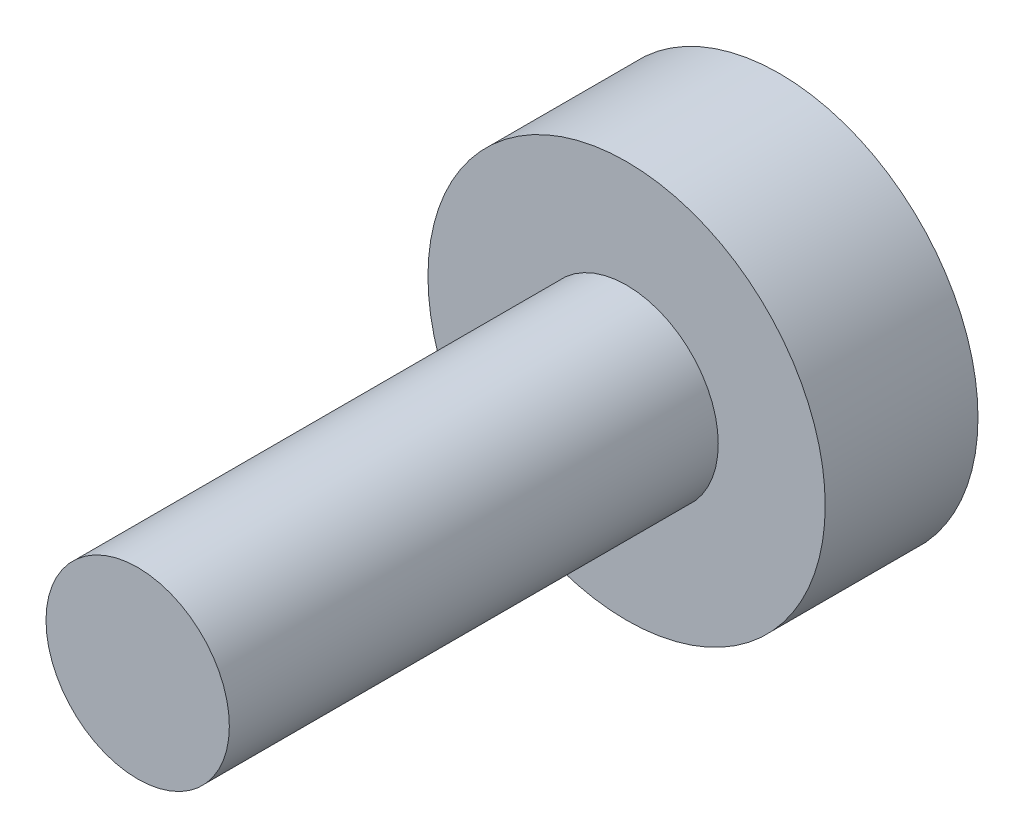
ISO-10303-21;
HEADER;
FILE_DESCRIPTION(('STEP AP214'),'2;1');
FILE_NAME('part.step','',(''),(''),'','','');
FILE_SCHEMA(('AUTOMOTIVE_DESIGN { 1 0 10303 214 1 1 1 1 }'));
ENDSEC;
DATA;
#1=APPLICATION_CONTEXT('core data for automotive mechanical design processes');
#2=APPLICATION_PROTOCOL_DEFINITION('international standard','automotive_design',2000,#1);
#3=PRODUCT_CONTEXT('',#1,'mechanical');
#4=PRODUCT('Part','Part','',(#3));
#5=PRODUCT_RELATED_PRODUCT_CATEGORY('part','',(#4));
#6=PRODUCT_DEFINITION_FORMATION('','',#4);
#7=PRODUCT_DEFINITION_CONTEXT('part definition',#1,'design');
#8=PRODUCT_DEFINITION('design','',#6,#7);
#9=PRODUCT_DEFINITION_SHAPE('','',#8);
#10=(LENGTH_UNIT() NAMED_UNIT(*) SI_UNIT(.MILLI.,.METRE.));
#11=(NAMED_UNIT(*) PLANE_ANGLE_UNIT() SI_UNIT($,.RADIAN.));
#12=(NAMED_UNIT(*) SI_UNIT($,.STERADIAN.) SOLID_ANGLE_UNIT());
#13=UNCERTAINTY_MEASURE_WITH_UNIT(LENGTH_MEASURE(1.E-05),#10,'distance_accuracy_value','');
#14=(GEOMETRIC_REPRESENTATION_CONTEXT(3) GLOBAL_UNCERTAINTY_ASSIGNED_CONTEXT((#13)) GLOBAL_UNIT_ASSIGNED_CONTEXT((#10,
#11,#12)) REPRESENTATION_CONTEXT('',''));
#15=CARTESIAN_POINT('',(0.,0.,0.));
#16=DIRECTION('',(0.,0.,1.));
#17=DIRECTION('',(1.,0.,0.));
#18=AXIS2_PLACEMENT_3D('',#15,#16,#17);
#19=CARTESIAN_POINT('',(0.,0.,5.));
#20=DIRECTION('',(0.,0.,-1.));
#21=DIRECTION('',(-1.,0.,0.));
#22=AXIS2_PLACEMENT_3D('',#19,#20,#21);
#23=CYLINDRICAL_SURFACE('',#22,6.5);
#24=CARTESIAN_POINT('',(0.,0.,5.));
#25=DIRECTION('',(0.,0.,1.));
#26=DIRECTION('',(1.,0.,0.));
#27=AXIS2_PLACEMENT_3D('',#24,#25,#26);
#28=CIRCLE('',#27,6.5);
#29=CARTESIAN_POINT('',(6.5,0.,5.));
#30=VERTEX_POINT('',#29);
#31=EDGE_CURVE('E10',#30,#30,#28,.T.);
#32=ORIENTED_EDGE('',*,*,#31,.F.);
#33=EDGE_LOOP('',(#32));
#34=FACE_BOUND('',#33,.T.);
#35=CARTESIAN_POINT('',(0.,0.,0.));
#36=DIRECTION('',(0.,0.,1.));
#37=DIRECTION('',(1.,0.,0.));
#38=AXIS2_PLACEMENT_3D('',#35,#36,#37);
#39=CIRCLE('',#38,6.5);
#40=CARTESIAN_POINT('',(6.5,0.,0.));
#41=VERTEX_POINT('',#40);
#42=EDGE_CURVE('E42',#41,#41,#39,.T.);
#43=ORIENTED_EDGE('',*,*,#42,.T.);
#44=EDGE_LOOP('',(#43));
#45=FACE_BOUND('',#44,.T.);
#46=ADVANCED_FACE('F39',(#34,#45),#23,.T.);
#47=CARTESIAN_POINT('',(0.,0.,5.));
#48=DIRECTION('',(0.,0.,1.));
#49=DIRECTION('',(1.,0.,0.));
#50=AXIS2_PLACEMENT_3D('',#47,#48,#49);
#51=PLANE('',#50);
#52=CARTESIAN_POINT('',(0.,0.,5.));
#53=DIRECTION('',(0.,0.,1.));
#54=DIRECTION('',(1.,0.,0.));
#55=AXIS2_PLACEMENT_3D('',#52,#53,#54);
#56=CIRCLE('',#55,3.);
#57=CARTESIAN_POINT('',(-3.,0.,5.));
#58=VERTEX_POINT('',#57);
#59=EDGE_CURVE('E49',#58,#58,#56,.F.);
#60=ORIENTED_EDGE('',*,*,#59,.T.);
#61=EDGE_LOOP('',(#60));
#62=FACE_BOUND('',#61,.T.);
#63=ORIENTED_EDGE('',*,*,#31,.T.);
#64=EDGE_LOOP('',(#63));
#65=FACE_BOUND('',#64,.T.);
#66=ADVANCED_FACE('F69',(#62,#65),#51,.T.);
#67=CARTESIAN_POINT('',(0.,0.,0.));
#68=DIRECTION('',(0.,0.,1.));
#69=DIRECTION('',(1.,0.,0.));
#70=AXIS2_PLACEMENT_3D('',#67,#68,#69);
#71=PLANE('',#70);
#72=ORIENTED_EDGE('',*,*,#42,.F.);
#73=EDGE_LOOP('',(#72));
#74=FACE_BOUND('',#73,.T.);
#75=ADVANCED_FACE('F61',(#74),#71,.F.);
#76=CARTESIAN_POINT('',(0.,0.,21.));
#77=DIRECTION('',(0.,0.,-1.));
#78=DIRECTION('',(-1.,0.,0.));
#79=AXIS2_PLACEMENT_3D('',#76,#77,#78);
#80=CYLINDRICAL_SURFACE('',#79,3.);
#81=CARTESIAN_POINT('',(0.,0.,21.));
#82=DIRECTION('',(0.,0.,1.));
#83=DIRECTION('',(1.,0.,0.));
#84=AXIS2_PLACEMENT_3D('',#81,#82,#83);
#85=CIRCLE('',#84,3.);
#86=CARTESIAN_POINT('',(-3.,0.,21.));
#87=VERTEX_POINT('',#86);
#88=EDGE_CURVE('E53',#87,#87,#85,.T.);
#89=CARTESIAN_POINT('',(-3.,0.,5.));
#90=CARTESIAN_POINT('',(-3.,0.,5.16666666666666));
#91=CARTESIAN_POINT('',(-3.,0.,5.33333333333333));
#92=CARTESIAN_POINT('',(-3.,0.,5.66666666666666));
#93=CARTESIAN_POINT('',(-3.,0.,5.83333333333333));
#94=CARTESIAN_POINT('',(-3.,0.,6.16666666666666));
#95=CARTESIAN_POINT('',(-3.,0.,6.33333333333333));
#96=CARTESIAN_POINT('',(-3.,0.,6.66666666666666));
#97=CARTESIAN_POINT('',(-3.,0.,6.83333333333333));
#98=CARTESIAN_POINT('',(-3.,0.,7.16666666666666));
#99=CARTESIAN_POINT('',(-3.,0.,7.33333333333333));
#100=CARTESIAN_POINT('',(-3.,0.,7.66666666666666));
#101=CARTESIAN_POINT('',(-3.,0.,7.83333333333333));
#102=CARTESIAN_POINT('',(-3.,0.,8.16666666666666));
#103=CARTESIAN_POINT('',(-3.,0.,8.33333333333333));
#104=CARTESIAN_POINT('',(-3.,0.,8.66666666666666));
#105=CARTESIAN_POINT('',(-3.,0.,8.83333333333333));
#106=CARTESIAN_POINT('',(-3.,0.,9.16666666666666));
#107=CARTESIAN_POINT('',(-3.,0.,9.33333333333333));
#108=CARTESIAN_POINT('',(-3.,0.,9.66666666666667));
#109=CARTESIAN_POINT('',(-3.,0.,9.83333333333333));
#110=CARTESIAN_POINT('',(-3.,0.,10.1666666666667));
#111=CARTESIAN_POINT('',(-3.,0.,10.3333333333333));
#112=CARTESIAN_POINT('',(-3.,0.,10.6666666666667));
#113=CARTESIAN_POINT('',(-3.,0.,10.8333333333333));
#114=CARTESIAN_POINT('',(-3.,0.,11.1666666666667));
#115=CARTESIAN_POINT('',(-3.,0.,11.3333333333333));
#116=CARTESIAN_POINT('',(-3.,0.,11.6666666666667));
#117=CARTESIAN_POINT('',(-3.,0.,11.8333333333333));
#118=CARTESIAN_POINT('',(-3.,0.,12.1666666666667));
#119=CARTESIAN_POINT('',(-3.,0.,12.3333333333333));
#120=CARTESIAN_POINT('',(-3.,0.,12.6666666666667));
#121=CARTESIAN_POINT('',(-3.,0.,12.8333333333333));
#122=CARTESIAN_POINT('',(-3.,0.,13.1666666666667));
#123=CARTESIAN_POINT('',(-3.,0.,13.3333333333333));
#124=CARTESIAN_POINT('',(-3.,0.,13.6666666666667));
#125=CARTESIAN_POINT('',(-3.,0.,13.8333333333333));
#126=CARTESIAN_POINT('',(-3.,0.,14.1666666666667));
#127=CARTESIAN_POINT('',(-3.,0.,14.3333333333333));
#128=CARTESIAN_POINT('',(-3.,0.,14.6666666666667));
#129=CARTESIAN_POINT('',(-3.,0.,14.8333333333333));
#130=CARTESIAN_POINT('',(-3.,0.,15.1666666666667));
#131=CARTESIAN_POINT('',(-3.,0.,15.3333333333333));
#132=CARTESIAN_POINT('',(-3.,0.,15.6666666666667));
#133=CARTESIAN_POINT('',(-3.,0.,15.8333333333333));
#134=CARTESIAN_POINT('',(-3.,0.,16.1666666666667));
#135=CARTESIAN_POINT('',(-3.,0.,16.3333333333333));
#136=CARTESIAN_POINT('',(-3.,0.,16.6666666666667));
#137=CARTESIAN_POINT('',(-3.,0.,16.8333333333333));
#138=CARTESIAN_POINT('',(-3.,0.,17.1666666666667));
#139=CARTESIAN_POINT('',(-3.,0.,17.3333333333333));
#140=CARTESIAN_POINT('',(-3.,0.,17.6666666666667));
#141=CARTESIAN_POINT('',(-3.,0.,17.8333333333333));
#142=CARTESIAN_POINT('',(-3.,0.,18.1666666666667));
#143=CARTESIAN_POINT('',(-3.,0.,18.3333333333333));
#144=CARTESIAN_POINT('',(-3.,0.,18.6666666666667));
#145=CARTESIAN_POINT('',(-3.,0.,18.8333333333333));
#146=CARTESIAN_POINT('',(-3.,0.,19.1666666666667));
#147=CARTESIAN_POINT('',(-3.,0.,19.3333333333333));
#148=CARTESIAN_POINT('',(-3.,0.,19.6666666666667));
#149=CARTESIAN_POINT('',(-3.,0.,19.8333333333333));
#150=CARTESIAN_POINT('',(-3.,0.,20.1666666666667));
#151=CARTESIAN_POINT('',(-3.,0.,20.3333333333333));
#152=CARTESIAN_POINT('',(-3.,0.,20.6666666666667));
#153=CARTESIAN_POINT('',(-3.,0.,20.8333333333333));
#154=CARTESIAN_POINT('',(-3.,0.,21.));
#155=B_SPLINE_CURVE_WITH_KNOTS('',3,(#89,#90,#91,#92,#93,#94,#95,#96,#97,#98,#99,#100,#101,#102,
#103,#104,#105,#106,#107,#108,#109,#110,#111,#112,#113,#114,#115,#116,#117,#118,#119,#120,#121,
#122,#123,#124,#125,#126,#127,#128,#129,#130,#131,#132,#133,#134,#135,#136,#137,#138,#139,#140,
#141,#142,#143,#144,#145,#146,#147,#148,#149,#150,#151,#152,#153,#154),.UNSPECIFIED.,.F.,.F.,(4,
2,2,2,2,2,2,2,2,2,2,2,2,2,2,2,2,2,2,2,2,2,2,2,2,2,2,2,2,2,2,2,4),(0.,0.499999999999999,
0.999999999999999,1.5,2.,2.5,3.,3.5,4.,4.5,5.,5.5,6.,6.5,7.,7.5,8.,8.5,9.,9.5,10.,10.5,11.,11.5,
12.,12.5,13.,13.5,14.,14.5,15.,15.5,16.),.UNSPECIFIED.);
#156=EDGE_CURVE('BSEAM59',#58,#87,#155,.T.);
#157=ORIENTED_EDGE('',*,*,#59,.F.);
#158=ORIENTED_EDGE('',*,*,#88,.F.);
#159=ORIENTED_EDGE('',*,*,#156,.T.);
#160=ORIENTED_EDGE('',*,*,#156,.F.);
#161=EDGE_LOOP('',(#157,#159,#158,#160));
#162=FACE_BOUND('',#161,.T.);
#163=ADVANCED_FACE('F59',(#162),#80,.T.);
#164=CARTESIAN_POINT('',(0.,0.,21.));
#165=DIRECTION('',(0.,0.,1.));
#166=DIRECTION('',(1.,0.,0.));
#167=AXIS2_PLACEMENT_3D('',#164,#165,#166);
#168=PLANE('',#167);
#169=ORIENTED_EDGE('',*,*,#88,.T.);
#170=EDGE_LOOP('',(#169));
#171=FACE_BOUND('',#170,.T.);
#172=ADVANCED_FACE('F57',(#171),#168,.T.);
#173=CLOSED_SHELL('',(#46,#66,#75,#163,#172));
#174=MANIFOLD_SOLID_BREP('B2',#173);
#175=ADVANCED_BREP_SHAPE_REPRESENTATION('',(#18,#174),#14);
#176=SHAPE_DEFINITION_REPRESENTATION(#9,#175);
ENDSEC;
END-ISO-10303-21;
